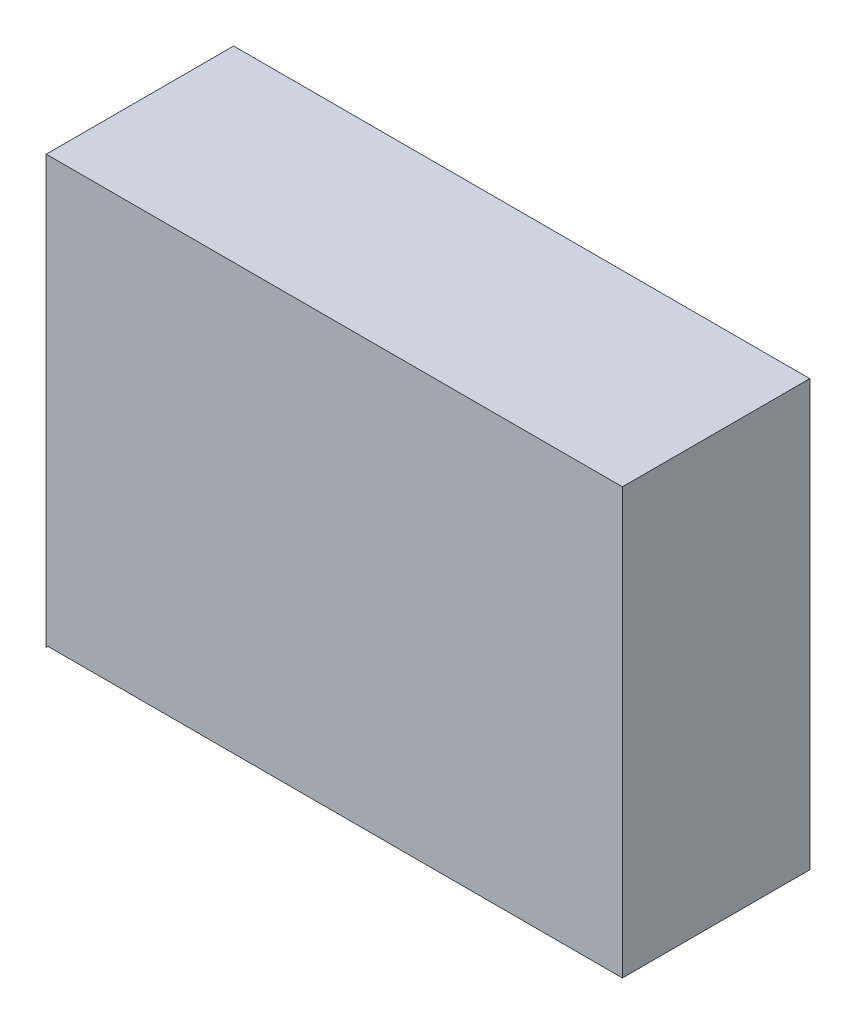
ISO-10303-21;
HEADER;
FILE_DESCRIPTION(('STEP AP214'),'2;1');
FILE_NAME('part.step','',(''),(''),'','','');
FILE_SCHEMA(('AUTOMOTIVE_DESIGN { 1 0 10303 214 1 1 1 1 }'));
ENDSEC;
DATA;
#1=APPLICATION_CONTEXT('core data for automotive mechanical design processes');
#2=APPLICATION_PROTOCOL_DEFINITION('international standard','automotive_design',2000,#1);
#3=PRODUCT_CONTEXT('',#1,'mechanical');
#4=PRODUCT('Part','Part','',(#3));
#5=PRODUCT_RELATED_PRODUCT_CATEGORY('part','',(#4));
#6=PRODUCT_DEFINITION_FORMATION('','',#4);
#7=PRODUCT_DEFINITION_CONTEXT('part definition',#1,'design');
#8=PRODUCT_DEFINITION('design','',#6,#7);
#9=PRODUCT_DEFINITION_SHAPE('','',#8);
#10=(LENGTH_UNIT() NAMED_UNIT(*) SI_UNIT(.MILLI.,.METRE.));
#11=(NAMED_UNIT(*) PLANE_ANGLE_UNIT() SI_UNIT($,.RADIAN.));
#12=(NAMED_UNIT(*) SI_UNIT($,.STERADIAN.) SOLID_ANGLE_UNIT());
#13=UNCERTAINTY_MEASURE_WITH_UNIT(LENGTH_MEASURE(1.E-05),#10,'distance_accuracy_value','');
#14=(GEOMETRIC_REPRESENTATION_CONTEXT(3) GLOBAL_UNCERTAINTY_ASSIGNED_CONTEXT((#13)) GLOBAL_UNIT_ASSIGNED_CONTEXT((#10,
#11,#12)) REPRESENTATION_CONTEXT('',''));
#15=CARTESIAN_POINT('',(0.,0.,0.));
#16=DIRECTION('',(0.,0.,1.));
#17=DIRECTION('',(1.,0.,0.));
#18=AXIS2_PLACEMENT_3D('',#15,#16,#17);
#19=CARTESIAN_POINT('',(-3.98749774,-2.94999918,0.));
#20=DIRECTION('',(0.707106781186048,-0.707106781187048,0.));
#21=DIRECTION('',(0.707106781187048,0.707106781186048,0.));
#22=AXIS2_PLACEMENT_3D('',#19,#20,#21);
#23=PLANE('',#22);
#24=DIRECTION('',(0.,0.,1.));
#25=VECTOR('',#24,1.);
#26=CARTESIAN_POINT('',(-4.01249896,-2.9750004,0.));
#27=LINE('',#26,#25);
#28=CARTESIAN_POINT('',(-4.01249896000001,-2.97500039999999,0.));
#29=VERTEX_POINT('',#28);
#30=CARTESIAN_POINT('',(-4.01249896000001,-2.97500039999999,2.60999986));
#31=VERTEX_POINT('',#30);
#32=EDGE_CURVE('E77',#29,#31,#27,.T.);
#33=ORIENTED_EDGE('',*,*,#32,.F.);
#34=DIRECTION('',(0.707106781187048,0.707106781186048,0.));
#35=VECTOR('',#34,1.);
#36=CARTESIAN_POINT('',(-3.98749774,-2.94999918,0.));
#37=LINE('',#36,#35);
#38=CARTESIAN_POINT('',(-3.98749774,-2.94999918,0.));
#39=VERTEX_POINT('',#38);
#40=EDGE_CURVE('E20',#29,#39,#37,.T.);
#41=ORIENTED_EDGE('',*,*,#40,.T.);
#42=DIRECTION('',(0.,0.,-1.));
#43=VECTOR('',#42,1.);
#44=CARTESIAN_POINT('',(-3.98749774,-2.94999918,0.));
#45=LINE('',#44,#43);
#46=CARTESIAN_POINT('',(-3.98749774,-2.94999918,2.60999986));
#47=VERTEX_POINT('',#46);
#48=EDGE_CURVE('E74',#47,#39,#45,.T.);
#49=ORIENTED_EDGE('',*,*,#48,.F.);
#50=DIRECTION('',(-0.70710678118656,-0.707106781186535,0.));
#51=VECTOR('',#50,1.);
#52=CARTESIAN_POINT('',(-3.98749774,-2.94999918,2.60999986));
#53=LINE('',#52,#51);
#54=EDGE_CURVE('E62',#47,#31,#53,.T.);
#55=ORIENTED_EDGE('',*,*,#54,.T.);
#56=EDGE_LOOP('',(#33,#41,#49,#55));
#57=FACE_BOUND('',#56,.T.);
#58=ADVANCED_FACE('F17',(#57),#23,.T.);
#59=CARTESIAN_POINT('',(4.0125015,-2.94999918,2.60999986));
#60=DIRECTION('',(0.,0.,-1.));
#61=DIRECTION('',(-1.,0.,0.));
#62=AXIS2_PLACEMENT_3D('',#59,#60,#61);
#63=PLANE('',#62);
#64=DIRECTION('',(1.,0.,0.));
#65=VECTOR('',#64,1.);
#66=CARTESIAN_POINT('',(-4.01249896,2.9750004,2.60999986));
#67=LINE('',#66,#65);
#68=CARTESIAN_POINT('',(-4.01249896,2.9750004,2.60999986));
#69=VERTEX_POINT('',#68);
#70=CARTESIAN_POINT('',(4.0125015,2.9750004,2.60999986));
#71=VERTEX_POINT('',#70);
#72=EDGE_CURVE('E90',#69,#71,#67,.T.);
#73=ORIENTED_EDGE('',*,*,#72,.F.);
#74=DIRECTION('',(0.,1.,0.));
#75=VECTOR('',#74,1.);
#76=CARTESIAN_POINT('',(-4.01249896,-2.9750004,2.60999986));
#77=LINE('',#76,#75);
#78=EDGE_CURVE('E71',#31,#69,#77,.T.);
#79=ORIENTED_EDGE('',*,*,#78,.F.);
#80=ORIENTED_EDGE('',*,*,#54,.F.);
#81=DIRECTION('',(1.,0.,0.));
#82=VECTOR('',#81,1.);
#83=CARTESIAN_POINT('',(4.0125015,-2.94999918,2.60999986));
#84=LINE('',#83,#82);
#85=CARTESIAN_POINT('',(4.0125015,-2.94999918,2.60999986));
#86=VERTEX_POINT('',#85);
#87=EDGE_CURVE('E69',#86,#47,#84,.F.);
#88=ORIENTED_EDGE('',*,*,#87,.F.);
#89=DIRECTION('',(0.,1.,0.));
#90=VECTOR('',#89,1.);
#91=CARTESIAN_POINT('',(4.0125015,2.9750004,2.60999986));
#92=LINE('',#91,#90);
#93=EDGE_CURVE('E93',#71,#86,#92,.F.);
#94=ORIENTED_EDGE('',*,*,#93,.F.);
#95=EDGE_LOOP('',(#73,#79,#80,#88,#94));
#96=FACE_BOUND('',#95,.T.);
#97=ADVANCED_FACE('F66',(#96),#63,.F.);
#98=CARTESIAN_POINT('',(4.0125015,-2.94999918,0.));
#99=DIRECTION('',(0.,-1.,0.));
#100=DIRECTION('',(0.,0.,-1.));
#101=AXIS2_PLACEMENT_3D('',#98,#99,#100);
#102=PLANE('',#101);
#103=ORIENTED_EDGE('',*,*,#48,.T.);
#104=DIRECTION('',(-1.,0.,0.));
#105=VECTOR('',#104,1.);
#106=CARTESIAN_POINT('',(4.0125015,-2.94999918,0.));
#107=LINE('',#106,#105);
#108=CARTESIAN_POINT('',(4.0125015,-2.94999918,0.));
#109=VERTEX_POINT('',#108);
#110=EDGE_CURVE('E96',#109,#39,#107,.T.);
#111=ORIENTED_EDGE('',*,*,#110,.F.);
#112=DIRECTION('',(0.,0.,-1.));
#113=VECTOR('',#112,1.);
#114=CARTESIAN_POINT('',(4.0125015,-2.94999918,0.));
#115=LINE('',#114,#113);
#116=EDGE_CURVE('E81',#86,#109,#115,.T.);
#117=ORIENTED_EDGE('',*,*,#116,.F.);
#118=ORIENTED_EDGE('',*,*,#87,.T.);
#119=EDGE_LOOP('',(#103,#111,#117,#118));
#120=FACE_BOUND('',#119,.T.);
#121=ADVANCED_FACE('F79',(#120),#102,.T.);
#122=CARTESIAN_POINT('',(-4.01249896,-2.9750004,0.));
#123=DIRECTION('',(-1.,0.,0.));
#124=DIRECTION('',(0.,0.,1.));
#125=AXIS2_PLACEMENT_3D('',#122,#123,#124);
#126=PLANE('',#125);
#127=DIRECTION('',(0.,0.,1.));
#128=VECTOR('',#127,1.);
#129=CARTESIAN_POINT('',(-4.01249896,2.9750004,0.));
#130=LINE('',#129,#128);
#131=CARTESIAN_POINT('',(-4.01249896,2.9750004,0.));
#132=VERTEX_POINT('',#131);
#133=EDGE_CURVE('E87',#132,#69,#130,.T.);
#134=ORIENTED_EDGE('',*,*,#133,.F.);
#135=DIRECTION('',(0.,1.,0.));
#136=VECTOR('',#135,1.);
#137=CARTESIAN_POINT('',(-4.01249896,-2.94999918,0.));
#138=LINE('',#137,#136);
#139=EDGE_CURVE('E98',#29,#132,#138,.T.);
#140=ORIENTED_EDGE('',*,*,#139,.F.);
#141=ORIENTED_EDGE('',*,*,#32,.T.);
#142=ORIENTED_EDGE('',*,*,#78,.T.);
#143=EDGE_LOOP('',(#134,#140,#141,#142));
#144=FACE_BOUND('',#143,.T.);
#145=ADVANCED_FACE('F107',(#144),#126,.T.);
#146=CARTESIAN_POINT('',(-4.01249896,2.9750004,0.));
#147=DIRECTION('',(0.,1.,0.));
#148=DIRECTION('',(0.,0.,1.));
#149=AXIS2_PLACEMENT_3D('',#146,#147,#148);
#150=PLANE('',#149);
#151=DIRECTION('',(0.,0.,-1.));
#152=VECTOR('',#151,1.);
#153=CARTESIAN_POINT('',(4.0125015,2.9750004,0.));
#154=LINE('',#153,#152);
#155=CARTESIAN_POINT('',(4.0125015,2.9750004,0.));
#156=VERTEX_POINT('',#155);
#157=EDGE_CURVE('E35',#156,#71,#154,.F.);
#158=ORIENTED_EDGE('',*,*,#157,.F.);
#159=DIRECTION('',(-1.,0.,0.));
#160=VECTOR('',#159,1.);
#161=CARTESIAN_POINT('',(4.0125015,2.9750004,0.));
#162=LINE('',#161,#160);
#163=EDGE_CURVE('E26',#132,#156,#162,.F.);
#164=ORIENTED_EDGE('',*,*,#163,.F.);
#165=ORIENTED_EDGE('',*,*,#133,.T.);
#166=ORIENTED_EDGE('',*,*,#72,.T.);
#167=EDGE_LOOP('',(#158,#164,#165,#166));
#168=FACE_BOUND('',#167,.T.);
#169=ADVANCED_FACE('F105',(#168),#150,.T.);
#170=CARTESIAN_POINT('',(4.0125015,2.9750004,0.));
#171=DIRECTION('',(1.,0.,0.));
#172=DIRECTION('',(0.,0.,-1.));
#173=AXIS2_PLACEMENT_3D('',#170,#171,#172);
#174=PLANE('',#173);
#175=ORIENTED_EDGE('',*,*,#116,.T.);
#176=DIRECTION('',(0.,1.,0.));
#177=VECTOR('',#176,1.);
#178=CARTESIAN_POINT('',(4.0125015,-2.94999918,0.));
#179=LINE('',#178,#177);
#180=EDGE_CURVE('E11',#156,#109,#179,.F.);
#181=ORIENTED_EDGE('',*,*,#180,.F.);
#182=ORIENTED_EDGE('',*,*,#157,.T.);
#183=ORIENTED_EDGE('',*,*,#93,.T.);
#184=EDGE_LOOP('',(#175,#181,#182,#183));
#185=FACE_BOUND('',#184,.T.);
#186=ADVANCED_FACE('F109',(#185),#174,.T.);
#187=CARTESIAN_POINT('',(4.0125015,-2.94999918,0.));
#188=DIRECTION('',(0.,0.,-1.));
#189=DIRECTION('',(-1.,0.,0.));
#190=AXIS2_PLACEMENT_3D('',#187,#188,#189);
#191=PLANE('',#190);
#192=ORIENTED_EDGE('',*,*,#163,.T.);
#193=ORIENTED_EDGE('',*,*,#180,.T.);
#194=ORIENTED_EDGE('',*,*,#110,.T.);
#195=ORIENTED_EDGE('',*,*,#40,.F.);
#196=ORIENTED_EDGE('',*,*,#139,.T.);
#197=EDGE_LOOP('',(#192,#193,#194,#195,#196));
#198=FACE_BOUND('',#197,.T.);
#199=ADVANCED_FACE('F103',(#198),#191,.T.);
#200=CLOSED_SHELL('',(#58,#97,#121,#145,#169,#186,#199));
#201=MANIFOLD_SOLID_BREP('B1',#200);
#202=ADVANCED_BREP_SHAPE_REPRESENTATION('',(#18,#201),#14);
#203=SHAPE_DEFINITION_REPRESENTATION(#9,#202);
ENDSEC;
END-ISO-10303-21;
